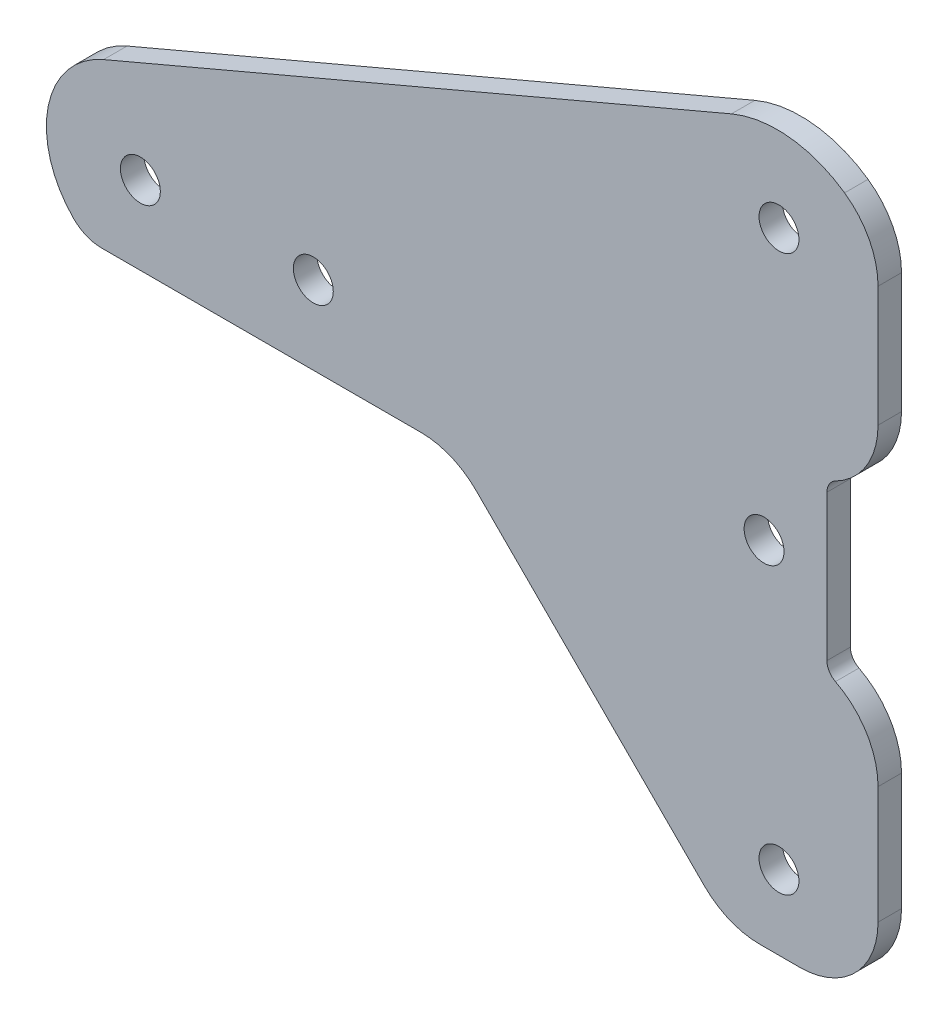
ISO-10303-21;
HEADER;
FILE_DESCRIPTION(('STEP AP214'),'2;1');
FILE_NAME('part.step','',(''),(''),'','','');
FILE_SCHEMA(('AUTOMOTIVE_DESIGN { 1 0 10303 214 1 1 1 1 }'));
ENDSEC;
DATA;
#1=APPLICATION_CONTEXT('core data for automotive mechanical design processes');
#2=APPLICATION_PROTOCOL_DEFINITION('international standard','automotive_design',2000,#1);
#3=PRODUCT_CONTEXT('',#1,'mechanical');
#4=PRODUCT('Part','Part','',(#3));
#5=PRODUCT_RELATED_PRODUCT_CATEGORY('part','',(#4));
#6=PRODUCT_DEFINITION_FORMATION('','',#4);
#7=PRODUCT_DEFINITION_CONTEXT('part definition',#1,'design');
#8=PRODUCT_DEFINITION('design','',#6,#7);
#9=PRODUCT_DEFINITION_SHAPE('','',#8);
#10=(LENGTH_UNIT() NAMED_UNIT(*) SI_UNIT(.MILLI.,.METRE.));
#11=(NAMED_UNIT(*) PLANE_ANGLE_UNIT() SI_UNIT($,.RADIAN.));
#12=(NAMED_UNIT(*) SI_UNIT($,.STERADIAN.) SOLID_ANGLE_UNIT());
#13=UNCERTAINTY_MEASURE_WITH_UNIT(LENGTH_MEASURE(1.E-05),#10,'distance_accuracy_value','');
#14=(GEOMETRIC_REPRESENTATION_CONTEXT(3) GLOBAL_UNCERTAINTY_ASSIGNED_CONTEXT((#13)) GLOBAL_UNIT_ASSIGNED_CONTEXT((#10,
#11,#12)) REPRESENTATION_CONTEXT('',''));
#15=CARTESIAN_POINT('',(0.,0.,0.));
#16=DIRECTION('',(0.,0.,1.));
#17=DIRECTION('',(1.,0.,0.));
#18=AXIS2_PLACEMENT_3D('',#15,#16,#17);
#19=CARTESIAN_POINT('',(-10.,20.0007818065908,3.));
#20=DIRECTION('',(0.,0.,-1.));
#21=DIRECTION('',(-1.,0.,0.));
#22=AXIS2_PLACEMENT_3D('',#19,#20,#21);
#23=PLANE('',#22);
#24=CARTESIAN_POINT('',(-10.,20.0007818065908,3.));
#25=DIRECTION('',(0.,0.,1.));
#26=DIRECTION('',(-1.,0.,0.));
#27=AXIS2_PLACEMENT_3D('',#24,#25,#26);
#28=CIRCLE('',#27,10.);
#29=CARTESIAN_POINT('',(-5.44166666666667,11.1001303010985,3.));
#30=VERTEX_POINT('',#29);
#31=CARTESIAN_POINT('',(0.,20.0007818065908,3.));
#32=VERTEX_POINT('',#31);
#33=EDGE_CURVE('E231',#30,#32,#28,.T.);
#34=ORIENTED_EDGE('',*,*,#33,.T.);
#35=DIRECTION('',(0.,1.,0.));
#36=VECTOR('',#35,1.);
#37=CARTESIAN_POINT('',(0.,20.0007818065908,3.));
#38=LINE('',#37,#36);
#39=CARTESIAN_POINT('',(0.,35.3807818065908,3.));
#40=VERTEX_POINT('',#39);
#41=EDGE_CURVE('E129',#32,#40,#38,.T.);
#42=ORIENTED_EDGE('',*,*,#41,.T.);
#43=CARTESIAN_POINT('',(-10.,35.3807818065908,3.));
#44=DIRECTION('',(0.,0.,1.));
#45=DIRECTION('',(-1.,0.,0.));
#46=AXIS2_PLACEMENT_3D('',#43,#44,#45);
#47=CIRCLE('',#46,10.);
#48=CARTESIAN_POINT('',(-4.27000000000017,43.5763354791624,3.));
#49=VERTEX_POINT('',#48);
#50=EDGE_CURVE('E276',#40,#49,#47,.T.);
#51=ORIENTED_EDGE('',*,*,#50,.T.);
#52=CARTESIAN_POINT('',(-12.8649999999999,31.2830049703049,3.));
#53=DIRECTION('',(0.,0.,1.));
#54=DIRECTION('',(-1.,0.,0.));
#55=AXIS2_PLACEMENT_3D('',#52,#53,#54);
#56=CIRCLE('',#55,15.);
#57=CARTESIAN_POINT('',(-18.7331957518129,45.0875070844126,3.));
#58=VERTEX_POINT('',#57);
#59=EDGE_CURVE('E295',#49,#58,#56,.T.);
#60=ORIENTED_EDGE('',*,*,#59,.T.);
#61=DIRECTION('',(-0.920300140940513,-0.391213050120868,0.));
#62=VECTOR('',#61,1.);
#63=CARTESIAN_POINT('',(-18.7331957518129,45.0875070844126,3.));
#64=LINE('',#63,#62);
#65=CARTESIAN_POINT('',(-98.9649620390068,10.9815533748754,3.));
#66=VERTEX_POINT('',#65);
#67=EDGE_CURVE('E292',#58,#66,#64,.T.);
#68=ORIENTED_EDGE('',*,*,#67,.T.);
#69=CARTESIAN_POINT('',(-94.2657220352064,-0.073065678539941,3.));
#70=DIRECTION('',(0.,0.,1.));
#71=DIRECTION('',(1.,0.,0.));
#72=AXIS2_PLACEMENT_3D('',#69,#70,#71);
#73=CIRCLE('',#72,12.0119714880386);
#74=CARTESIAN_POINT('',(-102.807556786901,-8.51845010461468,3.));
#75=VERTEX_POINT('',#74);
#76=EDGE_CURVE('E294',#66,#75,#73,.T.);
#77=ORIENTED_EDGE('',*,*,#76,.T.);
#78=CARTESIAN_POINT('',(-99.2520060764285,-5.003046977624,3.));
#79=DIRECTION('',(0.,0.,1.));
#80=DIRECTION('',(1.,0.,0.));
#81=AXIS2_PLACEMENT_3D('',#78,#79,#80);
#82=CIRCLE('',#81,5.00000000000001);
#83=CARTESIAN_POINT('',(-99.2520060764286,-10.003046977624,3.));
#84=VERTEX_POINT('',#83);
#85=EDGE_CURVE('E297',#75,#84,#82,.T.);
#86=ORIENTED_EDGE('',*,*,#85,.T.);
#87=DIRECTION('',(1.,0.,0.));
#88=VECTOR('',#87,1.);
#89=CARTESIAN_POINT('',(-99.2520060764286,-10.003046977624,3.));
#90=LINE('',#89,#88);
#91=CARTESIAN_POINT('',(-58.4120060764286,-10.003046977624,3.));
#92=VERTEX_POINT('',#91);
#93=EDGE_CURVE('E303',#84,#92,#90,.T.);
#94=ORIENTED_EDGE('',*,*,#93,.T.);
#95=CARTESIAN_POINT('',(-58.4120060764286,-20.003046977624,3.));
#96=DIRECTION('',(0.,0.,-1.));
#97=DIRECTION('',(-1.,0.,0.));
#98=AXIS2_PLACEMENT_3D('',#95,#96,#97);
#99=CIRCLE('',#98,10.);
#100=CARTESIAN_POINT('',(-51.3409382645631,-12.9319791657585,3.));
#101=VERTEX_POINT('',#100);
#102=EDGE_CURVE('E305',#92,#101,#99,.T.);
#103=ORIENTED_EDGE('',*,*,#102,.T.);
#104=DIRECTION('',(0.707106781186547,-0.707106781186548,0.));
#105=VECTOR('',#104,1.);
#106=CARTESIAN_POINT('',(-51.3409382645631,-12.9319791657585,3.));
#107=LINE('',#106,#105);
#108=CARTESIAN_POINT('',(-22.2010678118655,-42.0718496184562,3.));
#109=VERTEX_POINT('',#108);
#110=EDGE_CURVE('E307',#101,#109,#107,.T.);
#111=ORIENTED_EDGE('',*,*,#110,.T.);
#112=CARTESIAN_POINT('',(-15.13,-35.0007818065908,3.));
#113=DIRECTION('',(0.,0.,1.));
#114=DIRECTION('',(-1.,0.,0.));
#115=AXIS2_PLACEMENT_3D('',#112,#113,#114);
#116=CIRCLE('',#115,9.99999999999999);
#117=CARTESIAN_POINT('',(-15.13,-45.0007818065907,3.));
#118=VERTEX_POINT('',#117);
#119=EDGE_CURVE('E309',#109,#118,#116,.T.);
#120=ORIENTED_EDGE('',*,*,#119,.T.);
#121=DIRECTION('',(1.,0.,0.));
#122=VECTOR('',#121,1.);
#123=CARTESIAN_POINT('',(-15.13,-45.0007818065908,3.));
#124=LINE('',#123,#122);
#125=CARTESIAN_POINT('',(-10.,-45.0007818065908,3.));
#126=VERTEX_POINT('',#125);
#127=EDGE_CURVE('E311',#118,#126,#124,.T.);
#128=ORIENTED_EDGE('',*,*,#127,.T.);
#129=CARTESIAN_POINT('',(-10.,-35.0007818065907,3.));
#130=DIRECTION('',(0.,0.,1.));
#131=DIRECTION('',(-1.,0.,0.));
#132=AXIS2_PLACEMENT_3D('',#129,#130,#131);
#133=CIRCLE('',#132,10.);
#134=CARTESIAN_POINT('',(0.,-35.0007818065907,3.));
#135=VERTEX_POINT('',#134);
#136=EDGE_CURVE('E313',#126,#135,#133,.T.);
#137=ORIENTED_EDGE('',*,*,#136,.T.);
#138=DIRECTION('',(0.,1.,0.));
#139=VECTOR('',#138,1.);
#140=CARTESIAN_POINT('',(0.,-20.0007818065907,3.));
#141=LINE('',#140,#139);
#142=CARTESIAN_POINT('',(0.,-20.0007818065907,3.));
#143=VERTEX_POINT('',#142);
#144=EDGE_CURVE('E315',#135,#143,#141,.T.);
#145=ORIENTED_EDGE('',*,*,#144,.T.);
#146=CARTESIAN_POINT('',(-10.,-20.0007818065907,3.));
#147=DIRECTION('',(0.,0.,1.));
#148=DIRECTION('',(1.,0.,0.));
#149=AXIS2_PLACEMENT_3D('',#146,#147,#148);
#150=CIRCLE('',#149,10.);
#151=CARTESIAN_POINT('',(-5.44166666666666,-11.1001303010985,3.));
#152=VERTEX_POINT('',#151);
#153=EDGE_CURVE('E178',#143,#152,#150,.T.);
#154=ORIENTED_EDGE('',*,*,#153,.T.);
#155=CARTESIAN_POINT('',(-4.53,-9.32,3.));
#156=DIRECTION('',(0.,0.,-1.));
#157=DIRECTION('',(-1.,0.,0.));
#158=AXIS2_PLACEMENT_3D('',#155,#156,#157);
#159=CIRCLE('',#158,2.);
#160=CARTESIAN_POINT('',(-6.53,-9.32,3.));
#161=VERTEX_POINT('',#160);
#162=EDGE_CURVE('E172',#152,#161,#159,.T.);
#163=ORIENTED_EDGE('',*,*,#162,.T.);
#164=DIRECTION('',(0.,1.,0.));
#165=VECTOR('',#164,1.);
#166=CARTESIAN_POINT('',(-6.53,9.32,3.));
#167=LINE('',#166,#165);
#168=CARTESIAN_POINT('',(-6.53,9.32,3.));
#169=VERTEX_POINT('',#168);
#170=EDGE_CURVE('E176',#161,#169,#167,.T.);
#171=ORIENTED_EDGE('',*,*,#170,.T.);
#172=CARTESIAN_POINT('',(-4.53,9.32,3.));
#173=DIRECTION('',(0.,0.,-1.));
#174=DIRECTION('',(1.,0.,0.));
#175=AXIS2_PLACEMENT_3D('',#172,#173,#174);
#176=CIRCLE('',#175,2.);
#177=EDGE_CURVE('E56',#169,#30,#176,.T.);
#178=ORIENTED_EDGE('',*,*,#177,.T.);
#179=EDGE_LOOP('',(#34,#42,#51,#60,#68,#77,#86,#94,#103,#111,#120,#128,#137,#145,#154,#163,#171,#178));
#180=FACE_BOUND('',#179,.T.);
#181=CARTESIAN_POINT('',(-94.2643281289175,-0.00304697762400653,3.));
#182=DIRECTION('',(0.,0.,1.));
#183=DIRECTION('',(1.,0.,0.));
#184=AXIS2_PLACEMENT_3D('',#181,#182,#183);
#185=CIRCLE('',#184,2.54999999999999);
#186=CARTESIAN_POINT('',(-91.7143281289175,-0.00304697762400653,3.));
#187=VERTEX_POINT('',#186);
#188=EDGE_CURVE('E200',#187,#187,#185,.T.);
#189=ORIENTED_EDGE('',*,*,#188,.F.);
#190=EDGE_LOOP('',(#189));
#191=FACE_BOUND('',#190,.T.);
#192=CARTESIAN_POINT('',(-72.1643281289175,-0.00304697762400566,3.));
#193=DIRECTION('',(0.,0.,1.));
#194=DIRECTION('',(1.,0.,0.));
#195=AXIS2_PLACEMENT_3D('',#192,#193,#194);
#196=CIRCLE('',#195,2.54999999999999);
#197=CARTESIAN_POINT('',(-69.6143281289175,-0.00304697762400566,3.));
#198=VERTEX_POINT('',#197);
#199=EDGE_CURVE('E389',#198,#198,#196,.T.);
#200=ORIENTED_EDGE('',*,*,#199,.F.);
#201=EDGE_LOOP('',(#200));
#202=FACE_BOUND('',#201,.T.);
#203=CARTESIAN_POINT('',(-14.5643281289175,-0.00304697762400566,3.));
#204=DIRECTION('',(0.,0.,1.));
#205=DIRECTION('',(1.,0.,0.));
#206=AXIS2_PLACEMENT_3D('',#203,#204,#205);
#207=CIRCLE('',#206,2.55);
#208=CARTESIAN_POINT('',(-12.0143281289175,-0.00304697762400566,3.));
#209=VERTEX_POINT('',#208);
#210=EDGE_CURVE('E383',#209,#209,#207,.T.);
#211=ORIENTED_EDGE('',*,*,#210,.F.);
#212=EDGE_LOOP('',(#211));
#213=FACE_BOUND('',#212,.T.);
#214=CARTESIAN_POINT('',(-12.66,35.4992181934092,3.));
#215=DIRECTION('',(0.,0.,1.));
#216=DIRECTION('',(1.,0.,0.));
#217=AXIS2_PLACEMENT_3D('',#214,#215,#216);
#218=CIRCLE('',#217,2.55);
#219=CARTESIAN_POINT('',(-10.11,35.4992181934092,3.));
#220=VERTEX_POINT('',#219);
#221=EDGE_CURVE('E377',#220,#220,#218,.T.);
#222=ORIENTED_EDGE('',*,*,#221,.F.);
#223=EDGE_LOOP('',(#222));
#224=FACE_BOUND('',#223,.T.);
#225=CARTESIAN_POINT('',(-12.66,-35.5007818065907,3.));
#226=DIRECTION('',(0.,0.,1.));
#227=DIRECTION('',(1.,0.,0.));
#228=AXIS2_PLACEMENT_3D('',#225,#226,#227);
#229=CIRCLE('',#228,2.55);
#230=CARTESIAN_POINT('',(-10.11,-35.5007818065907,3.));
#231=VERTEX_POINT('',#230);
#232=EDGE_CURVE('E368',#231,#231,#229,.T.);
#233=ORIENTED_EDGE('',*,*,#232,.F.);
#234=EDGE_LOOP('',(#233));
#235=FACE_BOUND('',#234,.T.);
#236=ADVANCED_FACE('F39',(#180,#191,#202,#213,#224,#235),#23,.F.);
#237=CARTESIAN_POINT('',(-10.,20.0007818065908,0.));
#238=DIRECTION('',(0.,0.,-1.));
#239=DIRECTION('',(-1.,0.,0.));
#240=AXIS2_PLACEMENT_3D('',#237,#238,#239);
#241=PLANE('',#240);
#242=CARTESIAN_POINT('',(-12.66,35.4992181934092,0.));
#243=DIRECTION('',(0.,0.,1.));
#244=DIRECTION('',(1.,0.,0.));
#245=AXIS2_PLACEMENT_3D('',#242,#243,#244);
#246=CIRCLE('',#245,2.55);
#247=CARTESIAN_POINT('',(-10.11,35.4992181934092,0.));
#248=VERTEX_POINT('',#247);
#249=EDGE_CURVE('E374',#248,#248,#246,.T.);
#250=ORIENTED_EDGE('',*,*,#249,.T.);
#251=EDGE_LOOP('',(#250));
#252=FACE_BOUND('',#251,.T.);
#253=CARTESIAN_POINT('',(-72.1643281289175,-0.00304697762400566,0.));
#254=DIRECTION('',(0.,0.,1.));
#255=DIRECTION('',(1.,0.,0.));
#256=AXIS2_PLACEMENT_3D('',#253,#254,#255);
#257=CIRCLE('',#256,2.54999999999999);
#258=CARTESIAN_POINT('',(-69.6143281289175,-0.00304697762400566,0.));
#259=VERTEX_POINT('',#258);
#260=EDGE_CURVE('E386',#259,#259,#257,.T.);
#261=ORIENTED_EDGE('',*,*,#260,.T.);
#262=EDGE_LOOP('',(#261));
#263=FACE_BOUND('',#262,.T.);
#264=CARTESIAN_POINT('',(-10.,20.0007818065908,0.));
#265=DIRECTION('',(0.,0.,1.));
#266=DIRECTION('',(-1.,0.,0.));
#267=AXIS2_PLACEMENT_3D('',#264,#265,#266);
#268=CIRCLE('',#267,10.);
#269=CARTESIAN_POINT('',(-5.44166666666667,11.1001303010985,0.));
#270=VERTEX_POINT('',#269);
#271=CARTESIAN_POINT('',(0.,20.0007818065908,0.));
#272=VERTEX_POINT('',#271);
#273=EDGE_CURVE('E196',#270,#272,#268,.T.);
#274=ORIENTED_EDGE('',*,*,#273,.F.);
#275=CARTESIAN_POINT('',(-4.53,9.32,0.));
#276=DIRECTION('',(0.,0.,-1.));
#277=DIRECTION('',(1.,0.,0.));
#278=AXIS2_PLACEMENT_3D('',#275,#276,#277);
#279=CIRCLE('',#278,2.);
#280=CARTESIAN_POINT('',(-6.53,9.32,0.));
#281=VERTEX_POINT('',#280);
#282=EDGE_CURVE('E121',#281,#270,#279,.T.);
#283=ORIENTED_EDGE('',*,*,#282,.F.);
#284=DIRECTION('',(0.,1.,0.));
#285=VECTOR('',#284,1.);
#286=CARTESIAN_POINT('',(-6.53,9.32,0.));
#287=LINE('',#286,#285);
#288=CARTESIAN_POINT('',(-6.53,-9.32,0.));
#289=VERTEX_POINT('',#288);
#290=EDGE_CURVE('E115',#289,#281,#287,.T.);
#291=ORIENTED_EDGE('',*,*,#290,.F.);
#292=CARTESIAN_POINT('',(-4.53,-9.32,0.));
#293=DIRECTION('',(0.,0.,-1.));
#294=DIRECTION('',(-1.,0.,0.));
#295=AXIS2_PLACEMENT_3D('',#292,#293,#294);
#296=CIRCLE('',#295,2.);
#297=CARTESIAN_POINT('',(-5.44166666666666,-11.1001303010985,0.));
#298=VERTEX_POINT('',#297);
#299=EDGE_CURVE('E186',#298,#289,#296,.T.);
#300=ORIENTED_EDGE('',*,*,#299,.F.);
#301=CARTESIAN_POINT('',(-10.,-20.0007818065907,0.));
#302=DIRECTION('',(0.,0.,1.));
#303=DIRECTION('',(1.,0.,0.));
#304=AXIS2_PLACEMENT_3D('',#301,#302,#303);
#305=CIRCLE('',#304,10.);
#306=CARTESIAN_POINT('',(0.,-20.0007818065907,0.));
#307=VERTEX_POINT('',#306);
#308=EDGE_CURVE('E226',#307,#298,#305,.T.);
#309=ORIENTED_EDGE('',*,*,#308,.F.);
#310=DIRECTION('',(0.,1.,0.));
#311=VECTOR('',#310,1.);
#312=CARTESIAN_POINT('',(0.,-20.0007818065907,0.));
#313=LINE('',#312,#311);
#314=CARTESIAN_POINT('',(0.,-35.0007818065907,0.));
#315=VERTEX_POINT('',#314);
#316=EDGE_CURVE('E224',#315,#307,#313,.T.);
#317=ORIENTED_EDGE('',*,*,#316,.F.);
#318=CARTESIAN_POINT('',(-10.,-35.0007818065907,0.));
#319=DIRECTION('',(0.,0.,1.));
#320=DIRECTION('',(-1.,0.,0.));
#321=AXIS2_PLACEMENT_3D('',#318,#319,#320);
#322=CIRCLE('',#321,10.);
#323=CARTESIAN_POINT('',(-10.,-45.0007818065908,0.));
#324=VERTEX_POINT('',#323);
#325=EDGE_CURVE('E222',#324,#315,#322,.T.);
#326=ORIENTED_EDGE('',*,*,#325,.F.);
#327=DIRECTION('',(1.,0.,0.));
#328=VECTOR('',#327,1.);
#329=CARTESIAN_POINT('',(-15.13,-45.0007818065908,0.));
#330=LINE('',#329,#328);
#331=CARTESIAN_POINT('',(-15.13,-45.0007818065907,0.));
#332=VERTEX_POINT('',#331);
#333=EDGE_CURVE('E220',#332,#324,#330,.T.);
#334=ORIENTED_EDGE('',*,*,#333,.F.);
#335=CARTESIAN_POINT('',(-15.13,-35.0007818065908,0.));
#336=DIRECTION('',(0.,0.,1.));
#337=DIRECTION('',(-1.,0.,0.));
#338=AXIS2_PLACEMENT_3D('',#335,#336,#337);
#339=CIRCLE('',#338,9.99999999999999);
#340=CARTESIAN_POINT('',(-22.2010678118655,-42.0718496184562,0.));
#341=VERTEX_POINT('',#340);
#342=EDGE_CURVE('E218',#341,#332,#339,.T.);
#343=ORIENTED_EDGE('',*,*,#342,.F.);
#344=DIRECTION('',(0.707106781186547,-0.707106781186548,0.));
#345=VECTOR('',#344,1.);
#346=CARTESIAN_POINT('',(-51.3409382645631,-12.9319791657585,0.));
#347=LINE('',#346,#345);
#348=CARTESIAN_POINT('',(-51.3409382645631,-12.9319791657585,0.));
#349=VERTEX_POINT('',#348);
#350=EDGE_CURVE('E216',#349,#341,#347,.T.);
#351=ORIENTED_EDGE('',*,*,#350,.F.);
#352=CARTESIAN_POINT('',(-58.4120060764286,-20.003046977624,0.));
#353=DIRECTION('',(0.,0.,-1.));
#354=DIRECTION('',(-1.,0.,0.));
#355=AXIS2_PLACEMENT_3D('',#352,#353,#354);
#356=CIRCLE('',#355,10.);
#357=CARTESIAN_POINT('',(-58.4120060764286,-10.003046977624,0.));
#358=VERTEX_POINT('',#357);
#359=EDGE_CURVE('E214',#358,#349,#356,.T.);
#360=ORIENTED_EDGE('',*,*,#359,.F.);
#361=DIRECTION('',(1.,0.,0.));
#362=VECTOR('',#361,1.);
#363=CARTESIAN_POINT('',(-99.2520060764286,-10.003046977624,0.));
#364=LINE('',#363,#362);
#365=CARTESIAN_POINT('',(-99.2520060764286,-10.003046977624,0.));
#366=VERTEX_POINT('',#365);
#367=EDGE_CURVE('E212',#366,#358,#364,.T.);
#368=ORIENTED_EDGE('',*,*,#367,.F.);
#369=CARTESIAN_POINT('',(-99.2520060764285,-5.003046977624,0.));
#370=DIRECTION('',(0.,0.,1.));
#371=DIRECTION('',(1.,0.,0.));
#372=AXIS2_PLACEMENT_3D('',#369,#370,#371);
#373=CIRCLE('',#372,5.00000000000001);
#374=CARTESIAN_POINT('',(-102.807556786901,-8.51845010461468,0.));
#375=VERTEX_POINT('',#374);
#376=EDGE_CURVE('E210',#375,#366,#373,.T.);
#377=ORIENTED_EDGE('',*,*,#376,.F.);
#378=CARTESIAN_POINT('',(-94.2657220352064,-0.073065678539941,0.));
#379=DIRECTION('',(0.,0.,1.));
#380=DIRECTION('',(1.,0.,0.));
#381=AXIS2_PLACEMENT_3D('',#378,#379,#380);
#382=CIRCLE('',#381,12.0119714880386);
#383=CARTESIAN_POINT('',(-98.9649620390068,10.9815533748754,0.));
#384=VERTEX_POINT('',#383);
#385=EDGE_CURVE('E208',#384,#375,#382,.T.);
#386=ORIENTED_EDGE('',*,*,#385,.F.);
#387=DIRECTION('',(-0.920300140940513,-0.391213050120868,0.));
#388=VECTOR('',#387,1.);
#389=CARTESIAN_POINT('',(-18.7331957518129,45.0875070844126,0.));
#390=LINE('',#389,#388);
#391=CARTESIAN_POINT('',(-18.7331957518129,45.0875070844126,0.));
#392=VERTEX_POINT('',#391);
#393=EDGE_CURVE('E206',#392,#384,#390,.T.);
#394=ORIENTED_EDGE('',*,*,#393,.F.);
#395=CARTESIAN_POINT('',(-12.8649999999999,31.2830049703049,0.));
#396=DIRECTION('',(0.,0.,1.));
#397=DIRECTION('',(-1.,0.,0.));
#398=AXIS2_PLACEMENT_3D('',#395,#396,#397);
#399=CIRCLE('',#398,15.);
#400=CARTESIAN_POINT('',(-4.27000000000017,43.5763354791624,0.));
#401=VERTEX_POINT('',#400);
#402=EDGE_CURVE('E204',#401,#392,#399,.T.);
#403=ORIENTED_EDGE('',*,*,#402,.F.);
#404=CARTESIAN_POINT('',(-10.,35.3807818065908,0.));
#405=DIRECTION('',(0.,0.,1.));
#406=DIRECTION('',(-1.,0.,0.));
#407=AXIS2_PLACEMENT_3D('',#404,#405,#406);
#408=CIRCLE('',#407,10.);
#409=CARTESIAN_POINT('',(0.,35.3807818065908,0.));
#410=VERTEX_POINT('',#409);
#411=EDGE_CURVE('E202',#410,#401,#408,.T.);
#412=ORIENTED_EDGE('',*,*,#411,.F.);
#413=DIRECTION('',(0.,1.,0.));
#414=VECTOR('',#413,1.);
#415=CARTESIAN_POINT('',(0.,20.0007818065908,0.));
#416=LINE('',#415,#414);
#417=EDGE_CURVE('E199',#272,#410,#416,.T.);
#418=ORIENTED_EDGE('',*,*,#417,.F.);
#419=EDGE_LOOP('',(#274,#283,#291,#300,#309,#317,#326,#334,#343,#351,#360,#368,#377,#386,#394,
#403,#412,#418));
#420=FACE_BOUND('',#419,.T.);
#421=CARTESIAN_POINT('',(-94.2643281289175,-0.00304697762400653,0.));
#422=DIRECTION('',(0.,0.,1.));
#423=DIRECTION('',(1.,0.,0.));
#424=AXIS2_PLACEMENT_3D('',#421,#422,#423);
#425=CIRCLE('',#424,2.54999999999999);
#426=CARTESIAN_POINT('',(-91.7143281289175,-0.00304697762400653,0.));
#427=VERTEX_POINT('',#426);
#428=EDGE_CURVE('E392',#427,#427,#425,.T.);
#429=ORIENTED_EDGE('',*,*,#428,.T.);
#430=EDGE_LOOP('',(#429));
#431=FACE_BOUND('',#430,.T.);
#432=CARTESIAN_POINT('',(-14.5643281289175,-0.00304697762400566,0.));
#433=DIRECTION('',(0.,0.,1.));
#434=DIRECTION('',(1.,0.,0.));
#435=AXIS2_PLACEMENT_3D('',#432,#433,#434);
#436=CIRCLE('',#435,2.55);
#437=CARTESIAN_POINT('',(-12.0143281289175,-0.00304697762400566,0.));
#438=VERTEX_POINT('',#437);
#439=EDGE_CURVE('E380',#438,#438,#436,.T.);
#440=ORIENTED_EDGE('',*,*,#439,.T.);
#441=EDGE_LOOP('',(#440));
#442=FACE_BOUND('',#441,.T.);
#443=CARTESIAN_POINT('',(-12.66,-35.5007818065907,0.));
#444=DIRECTION('',(0.,0.,1.));
#445=DIRECTION('',(1.,0.,0.));
#446=AXIS2_PLACEMENT_3D('',#443,#444,#445);
#447=CIRCLE('',#446,2.55);
#448=CARTESIAN_POINT('',(-10.11,-35.5007818065907,0.));
#449=VERTEX_POINT('',#448);
#450=EDGE_CURVE('E371',#449,#449,#447,.T.);
#451=ORIENTED_EDGE('',*,*,#450,.T.);
#452=EDGE_LOOP('',(#451));
#453=FACE_BOUND('',#452,.T.);
#454=ADVANCED_FACE('F280',(#252,#263,#420,#431,#442,#453),#241,.T.);
#455=CARTESIAN_POINT('',(-10.,20.0007818065908,3.));
#456=DIRECTION('',(0.,0.,-1.));
#457=DIRECTION('',(-1.,0.,0.));
#458=AXIS2_PLACEMENT_3D('',#455,#456,#457);
#459=CYLINDRICAL_SURFACE('',#458,10.);
#460=ORIENTED_EDGE('',*,*,#273,.T.);
#461=DIRECTION('',(0.,0.,-1.));
#462=VECTOR('',#461,1.);
#463=CARTESIAN_POINT('',(0.,20.0007818065908,3.));
#464=LINE('',#463,#462);
#465=EDGE_CURVE('E11',#32,#272,#464,.T.);
#466=ORIENTED_EDGE('',*,*,#465,.F.);
#467=ORIENTED_EDGE('',*,*,#33,.F.);
#468=DIRECTION('',(0.,0.,-1.));
#469=VECTOR('',#468,1.);
#470=CARTESIAN_POINT('',(-5.44166666666667,11.1001303010985,3.));
#471=LINE('',#470,#469);
#472=EDGE_CURVE('E192',#30,#270,#471,.T.);
#473=ORIENTED_EDGE('',*,*,#472,.T.);
#474=EDGE_LOOP('',(#460,#466,#467,#473));
#475=FACE_BOUND('',#474,.T.);
#476=ADVANCED_FACE('F41',(#475),#459,.T.);
#477=CARTESIAN_POINT('',(0.,20.0007818065908,3.));
#478=DIRECTION('',(-1.,0.,0.));
#479=DIRECTION('',(0.,0.,1.));
#480=AXIS2_PLACEMENT_3D('',#477,#478,#479);
#481=PLANE('',#480);
#482=ORIENTED_EDGE('',*,*,#417,.T.);
#483=DIRECTION('',(0.,0.,-1.));
#484=VECTOR('',#483,1.);
#485=CARTESIAN_POINT('',(0.,35.3807818065908,3.));
#486=LINE('',#485,#484);
#487=EDGE_CURVE('E48',#40,#410,#486,.T.);
#488=ORIENTED_EDGE('',*,*,#487,.F.);
#489=ORIENTED_EDGE('',*,*,#41,.F.);
#490=ORIENTED_EDGE('',*,*,#465,.T.);
#491=EDGE_LOOP('',(#482,#488,#489,#490));
#492=FACE_BOUND('',#491,.T.);
#493=ADVANCED_FACE('F578',(#492),#481,.F.);
#494=CARTESIAN_POINT('',(-10.,35.3807818065908,3.));
#495=DIRECTION('',(0.,0.,-1.));
#496=DIRECTION('',(-1.,0.,0.));
#497=AXIS2_PLACEMENT_3D('',#494,#495,#496);
#498=CYLINDRICAL_SURFACE('',#497,10.);
#499=ORIENTED_EDGE('',*,*,#411,.T.);
#500=DIRECTION('',(0.,0.,-1.));
#501=VECTOR('',#500,1.);
#502=CARTESIAN_POINT('',(-4.27000000000017,43.5763354791624,3.));
#503=LINE('',#502,#501);
#504=EDGE_CURVE('E268',#49,#401,#503,.T.);
#505=ORIENTED_EDGE('',*,*,#504,.F.);
#506=ORIENTED_EDGE('',*,*,#50,.F.);
#507=ORIENTED_EDGE('',*,*,#487,.T.);
#508=EDGE_LOOP('',(#499,#505,#506,#507));
#509=FACE_BOUND('',#508,.T.);
#510=ADVANCED_FACE('F274',(#509),#498,.T.);
#511=CARTESIAN_POINT('',(-12.8649999999999,31.2830049703049,3.));
#512=DIRECTION('',(0.,0.,-1.));
#513=DIRECTION('',(-1.,0.,0.));
#514=AXIS2_PLACEMENT_3D('',#511,#512,#513);
#515=CYLINDRICAL_SURFACE('',#514,15.);
#516=ORIENTED_EDGE('',*,*,#402,.T.);
#517=DIRECTION('',(0.,0.,-1.));
#518=VECTOR('',#517,1.);
#519=CARTESIAN_POINT('',(-18.7331957518129,45.0875070844126,3.));
#520=LINE('',#519,#518);
#521=EDGE_CURVE('E265',#58,#392,#520,.T.);
#522=ORIENTED_EDGE('',*,*,#521,.F.);
#523=ORIENTED_EDGE('',*,*,#59,.F.);
#524=ORIENTED_EDGE('',*,*,#504,.T.);
#525=EDGE_LOOP('',(#516,#522,#523,#524));
#526=FACE_BOUND('',#525,.T.);
#527=ADVANCED_FACE('F286',(#526),#515,.T.);
#528=CARTESIAN_POINT('',(-18.7331957518129,45.0875070844126,3.));
#529=DIRECTION('',(0.391213050120868,-0.920300140940513,0.));
#530=DIRECTION('',(0.920300140940513,0.391213050120868,0.));
#531=AXIS2_PLACEMENT_3D('',#528,#529,#530);
#532=PLANE('',#531);
#533=ORIENTED_EDGE('',*,*,#393,.T.);
#534=DIRECTION('',(0.,0.,-1.));
#535=VECTOR('',#534,1.);
#536=CARTESIAN_POINT('',(-98.9649620390068,10.9815533748754,3.));
#537=LINE('',#536,#535);
#538=EDGE_CURVE('E262',#66,#384,#537,.T.);
#539=ORIENTED_EDGE('',*,*,#538,.F.);
#540=ORIENTED_EDGE('',*,*,#67,.F.);
#541=ORIENTED_EDGE('',*,*,#521,.T.);
#542=EDGE_LOOP('',(#533,#539,#540,#541));
#543=FACE_BOUND('',#542,.T.);
#544=ADVANCED_FACE('F290',(#543),#532,.F.);
#545=CARTESIAN_POINT('',(-94.2657220352064,-0.073065678539941,3.));
#546=DIRECTION('',(0.,0.,-1.));
#547=DIRECTION('',(-1.,0.,0.));
#548=AXIS2_PLACEMENT_3D('',#545,#546,#547);
#549=CYLINDRICAL_SURFACE('',#548,12.0119714880386);
#550=ORIENTED_EDGE('',*,*,#385,.T.);
#551=DIRECTION('',(0.,0.,-1.));
#552=VECTOR('',#551,1.);
#553=CARTESIAN_POINT('',(-102.807556786901,-8.51845010461468,3.));
#554=LINE('',#553,#552);
#555=EDGE_CURVE('E259',#75,#375,#554,.T.);
#556=ORIENTED_EDGE('',*,*,#555,.F.);
#557=ORIENTED_EDGE('',*,*,#76,.F.);
#558=ORIENTED_EDGE('',*,*,#538,.T.);
#559=EDGE_LOOP('',(#550,#556,#557,#558));
#560=FACE_BOUND('',#559,.T.);
#561=ADVANCED_FACE('F543',(#560),#549,.T.);
#562=CARTESIAN_POINT('',(-99.2520060764285,-5.003046977624,3.));
#563=DIRECTION('',(0.,0.,-1.));
#564=DIRECTION('',(-1.,0.,0.));
#565=AXIS2_PLACEMENT_3D('',#562,#563,#564);
#566=CYLINDRICAL_SURFACE('',#565,5.00000000000001);
#567=ORIENTED_EDGE('',*,*,#376,.T.);
#568=DIRECTION('',(0.,0.,-1.));
#569=VECTOR('',#568,1.);
#570=CARTESIAN_POINT('',(-99.2520060764286,-10.003046977624,3.));
#571=LINE('',#570,#569);
#572=EDGE_CURVE('E256',#84,#366,#571,.T.);
#573=ORIENTED_EDGE('',*,*,#572,.F.);
#574=ORIENTED_EDGE('',*,*,#85,.F.);
#575=ORIENTED_EDGE('',*,*,#555,.T.);
#576=EDGE_LOOP('',(#567,#573,#574,#575));
#577=FACE_BOUND('',#576,.T.);
#578=ADVANCED_FACE('F533',(#577),#566,.T.);
#579=CARTESIAN_POINT('',(-99.2520060764286,-10.003046977624,3.));
#580=DIRECTION('',(0.,1.,0.));
#581=DIRECTION('',(-1.,0.,0.));
#582=AXIS2_PLACEMENT_3D('',#579,#580,#581);
#583=PLANE('',#582);
#584=ORIENTED_EDGE('',*,*,#367,.T.);
#585=DIRECTION('',(0.,0.,-1.));
#586=VECTOR('',#585,1.);
#587=CARTESIAN_POINT('',(-58.4120060764286,-10.003046977624,3.));
#588=LINE('',#587,#586);
#589=EDGE_CURVE('E253',#92,#358,#588,.T.);
#590=ORIENTED_EDGE('',*,*,#589,.F.);
#591=ORIENTED_EDGE('',*,*,#93,.F.);
#592=ORIENTED_EDGE('',*,*,#572,.T.);
#593=EDGE_LOOP('',(#584,#590,#591,#592));
#594=FACE_BOUND('',#593,.T.);
#595=ADVANCED_FACE('F523',(#594),#583,.F.);
#596=CARTESIAN_POINT('',(-58.4120060764286,-20.003046977624,3.));
#597=DIRECTION('',(0.,0.,-1.));
#598=DIRECTION('',(-1.,0.,0.));
#599=AXIS2_PLACEMENT_3D('',#596,#597,#598);
#600=CYLINDRICAL_SURFACE('',#599,10.);
#601=ORIENTED_EDGE('',*,*,#359,.T.);
#602=DIRECTION('',(0.,0.,-1.));
#603=VECTOR('',#602,1.);
#604=CARTESIAN_POINT('',(-51.3409382645631,-12.9319791657585,3.));
#605=LINE('',#604,#603);
#606=EDGE_CURVE('E250',#101,#349,#605,.T.);
#607=ORIENTED_EDGE('',*,*,#606,.F.);
#608=ORIENTED_EDGE('',*,*,#102,.F.);
#609=ORIENTED_EDGE('',*,*,#589,.T.);
#610=EDGE_LOOP('',(#601,#607,#608,#609));
#611=FACE_BOUND('',#610,.T.);
#612=ADVANCED_FACE('F513',(#611),#600,.F.);
#613=CARTESIAN_POINT('',(-51.3409382645631,-12.9319791657585,3.));
#614=DIRECTION('',(0.707106781186548,0.707106781186547,0.));
#615=DIRECTION('',(-0.707106781186547,0.707106781186548,0.));
#616=AXIS2_PLACEMENT_3D('',#613,#614,#615);
#617=PLANE('',#616);
#618=ORIENTED_EDGE('',*,*,#350,.T.);
#619=DIRECTION('',(0.,0.,-1.));
#620=VECTOR('',#619,1.);
#621=CARTESIAN_POINT('',(-22.2010678118655,-42.0718496184562,3.));
#622=LINE('',#621,#620);
#623=EDGE_CURVE('E247',#109,#341,#622,.T.);
#624=ORIENTED_EDGE('',*,*,#623,.F.);
#625=ORIENTED_EDGE('',*,*,#110,.F.);
#626=ORIENTED_EDGE('',*,*,#606,.T.);
#627=EDGE_LOOP('',(#618,#624,#625,#626));
#628=FACE_BOUND('',#627,.T.);
#629=ADVANCED_FACE('F503',(#628),#617,.F.);
#630=CARTESIAN_POINT('',(-15.13,-35.0007818065908,3.));
#631=DIRECTION('',(0.,0.,-1.));
#632=DIRECTION('',(-1.,0.,0.));
#633=AXIS2_PLACEMENT_3D('',#630,#631,#632);
#634=CYLINDRICAL_SURFACE('',#633,9.99999999999999);
#635=ORIENTED_EDGE('',*,*,#342,.T.);
#636=DIRECTION('',(0.,0.,-1.));
#637=VECTOR('',#636,1.);
#638=CARTESIAN_POINT('',(-15.13,-45.0007818065907,3.));
#639=LINE('',#638,#637);
#640=EDGE_CURVE('E244',#118,#332,#639,.T.);
#641=ORIENTED_EDGE('',*,*,#640,.F.);
#642=ORIENTED_EDGE('',*,*,#119,.F.);
#643=ORIENTED_EDGE('',*,*,#623,.T.);
#644=EDGE_LOOP('',(#635,#641,#642,#643));
#645=FACE_BOUND('',#644,.T.);
#646=ADVANCED_FACE('F493',(#645),#634,.T.);
#647=CARTESIAN_POINT('',(-15.13,-45.0007818065908,3.));
#648=DIRECTION('',(0.,1.,0.));
#649=DIRECTION('',(0.,0.,1.));
#650=AXIS2_PLACEMENT_3D('',#647,#648,#649);
#651=PLANE('',#650);
#652=ORIENTED_EDGE('',*,*,#333,.T.);
#653=DIRECTION('',(0.,0.,-1.));
#654=VECTOR('',#653,1.);
#655=CARTESIAN_POINT('',(-10.,-45.0007818065908,3.));
#656=LINE('',#655,#654);
#657=EDGE_CURVE('E241',#126,#324,#656,.T.);
#658=ORIENTED_EDGE('',*,*,#657,.F.);
#659=ORIENTED_EDGE('',*,*,#127,.F.);
#660=ORIENTED_EDGE('',*,*,#640,.T.);
#661=EDGE_LOOP('',(#652,#658,#659,#660));
#662=FACE_BOUND('',#661,.T.);
#663=ADVANCED_FACE('F483',(#662),#651,.F.);
#664=CARTESIAN_POINT('',(-10.,-35.0007818065907,3.));
#665=DIRECTION('',(0.,0.,-1.));
#666=DIRECTION('',(-1.,0.,0.));
#667=AXIS2_PLACEMENT_3D('',#664,#665,#666);
#668=CYLINDRICAL_SURFACE('',#667,10.);
#669=ORIENTED_EDGE('',*,*,#325,.T.);
#670=DIRECTION('',(0.,0.,-1.));
#671=VECTOR('',#670,1.);
#672=CARTESIAN_POINT('',(0.,-35.0007818065907,3.));
#673=LINE('',#672,#671);
#674=EDGE_CURVE('E238',#135,#315,#673,.T.);
#675=ORIENTED_EDGE('',*,*,#674,.F.);
#676=ORIENTED_EDGE('',*,*,#136,.F.);
#677=ORIENTED_EDGE('',*,*,#657,.T.);
#678=EDGE_LOOP('',(#669,#675,#676,#677));
#679=FACE_BOUND('',#678,.T.);
#680=ADVANCED_FACE('F474',(#679),#668,.T.);
#681=CARTESIAN_POINT('',(0.,-20.0007818065907,3.));
#682=DIRECTION('',(-1.,0.,0.));
#683=DIRECTION('',(0.,-1.,0.));
#684=AXIS2_PLACEMENT_3D('',#681,#682,#683);
#685=PLANE('',#684);
#686=ORIENTED_EDGE('',*,*,#316,.T.);
#687=DIRECTION('',(0.,0.,-1.));
#688=VECTOR('',#687,1.);
#689=CARTESIAN_POINT('',(0.,-20.0007818065907,3.));
#690=LINE('',#689,#688);
#691=EDGE_CURVE('E235',#143,#307,#690,.T.);
#692=ORIENTED_EDGE('',*,*,#691,.F.);
#693=ORIENTED_EDGE('',*,*,#144,.F.);
#694=ORIENTED_EDGE('',*,*,#674,.T.);
#695=EDGE_LOOP('',(#686,#692,#693,#694));
#696=FACE_BOUND('',#695,.T.);
#697=ADVANCED_FACE('F321',(#696),#685,.F.);
#698=CARTESIAN_POINT('',(-10.,-20.0007818065907,3.));
#699=DIRECTION('',(0.,0.,-1.));
#700=DIRECTION('',(-1.,0.,0.));
#701=AXIS2_PLACEMENT_3D('',#698,#699,#700);
#702=CYLINDRICAL_SURFACE('',#701,10.);
#703=ORIENTED_EDGE('',*,*,#308,.T.);
#704=DIRECTION('',(0.,0.,-1.));
#705=VECTOR('',#704,1.);
#706=CARTESIAN_POINT('',(-5.44166666666666,-11.1001303010985,3.));
#707=LINE('',#706,#705);
#708=EDGE_CURVE('E187',#152,#298,#707,.T.);
#709=ORIENTED_EDGE('',*,*,#708,.F.);
#710=ORIENTED_EDGE('',*,*,#153,.F.);
#711=ORIENTED_EDGE('',*,*,#691,.T.);
#712=EDGE_LOOP('',(#703,#709,#710,#711));
#713=FACE_BOUND('',#712,.T.);
#714=ADVANCED_FACE('F325',(#713),#702,.T.);
#715=CARTESIAN_POINT('',(-4.53,-9.32,3.));
#716=DIRECTION('',(0.,0.,-1.));
#717=DIRECTION('',(-1.,0.,0.));
#718=AXIS2_PLACEMENT_3D('',#715,#716,#717);
#719=CYLINDRICAL_SURFACE('',#718,2.);
#720=ORIENTED_EDGE('',*,*,#299,.T.);
#721=DIRECTION('',(0.,0.,-1.));
#722=VECTOR('',#721,1.);
#723=CARTESIAN_POINT('',(-6.53,-9.32,3.));
#724=LINE('',#723,#722);
#725=EDGE_CURVE('E183',#161,#289,#724,.T.);
#726=ORIENTED_EDGE('',*,*,#725,.F.);
#727=ORIENTED_EDGE('',*,*,#162,.F.);
#728=ORIENTED_EDGE('',*,*,#708,.T.);
#729=EDGE_LOOP('',(#720,#726,#727,#728));
#730=FACE_BOUND('',#729,.T.);
#731=ADVANCED_FACE('F184',(#730),#719,.F.);
#732=CARTESIAN_POINT('',(-6.53,9.32,3.));
#733=DIRECTION('',(-1.,0.,0.));
#734=DIRECTION('',(0.,0.,1.));
#735=AXIS2_PLACEMENT_3D('',#732,#733,#734);
#736=PLANE('',#735);
#737=ORIENTED_EDGE('',*,*,#290,.T.);
#738=DIRECTION('',(0.,0.,-1.));
#739=VECTOR('',#738,1.);
#740=CARTESIAN_POINT('',(-6.53,9.32,3.));
#741=LINE('',#740,#739);
#742=EDGE_CURVE('E188',#169,#281,#741,.T.);
#743=ORIENTED_EDGE('',*,*,#742,.F.);
#744=ORIENTED_EDGE('',*,*,#170,.F.);
#745=ORIENTED_EDGE('',*,*,#725,.T.);
#746=EDGE_LOOP('',(#737,#743,#744,#745));
#747=FACE_BOUND('',#746,.T.);
#748=ADVANCED_FACE('F190',(#747),#736,.F.);
#749=CARTESIAN_POINT('',(-4.53,9.32,3.));
#750=DIRECTION('',(0.,0.,-1.));
#751=DIRECTION('',(-1.,0.,0.));
#752=AXIS2_PLACEMENT_3D('',#749,#750,#751);
#753=CYLINDRICAL_SURFACE('',#752,2.);
#754=ORIENTED_EDGE('',*,*,#282,.T.);
#755=ORIENTED_EDGE('',*,*,#472,.F.);
#756=ORIENTED_EDGE('',*,*,#177,.F.);
#757=ORIENTED_EDGE('',*,*,#742,.T.);
#758=EDGE_LOOP('',(#754,#755,#756,#757));
#759=FACE_BOUND('',#758,.T.);
#760=ADVANCED_FACE('F329',(#759),#753,.F.);
#761=CARTESIAN_POINT('',(-94.2643281289175,-0.00304697762400653,3.));
#762=DIRECTION('',(0.,0.,-1.));
#763=DIRECTION('',(-1.,0.,0.));
#764=AXIS2_PLACEMENT_3D('',#761,#762,#763);
#765=CYLINDRICAL_SURFACE('',#764,2.54999999999999);
#766=ORIENTED_EDGE('',*,*,#188,.T.);
#767=EDGE_LOOP('',(#766));
#768=FACE_BOUND('',#767,.T.);
#769=ORIENTED_EDGE('',*,*,#428,.F.);
#770=EDGE_LOOP('',(#769));
#771=FACE_BOUND('',#770,.T.);
#772=ADVANCED_FACE('F331',(#768,#771),#765,.F.);
#773=CARTESIAN_POINT('',(-72.1643281289175,-0.00304697762400566,3.));
#774=DIRECTION('',(0.,0.,-1.));
#775=DIRECTION('',(-1.,0.,0.));
#776=AXIS2_PLACEMENT_3D('',#773,#774,#775);
#777=CYLINDRICAL_SURFACE('',#776,2.54999999999999);
#778=ORIENTED_EDGE('',*,*,#199,.T.);
#779=EDGE_LOOP('',(#778));
#780=FACE_BOUND('',#779,.T.);
#781=ORIENTED_EDGE('',*,*,#260,.F.);
#782=EDGE_LOOP('',(#781));
#783=FACE_BOUND('',#782,.T.);
#784=ADVANCED_FACE('F337',(#780,#783),#777,.F.);
#785=CARTESIAN_POINT('',(-14.5643281289175,-0.00304697762400566,3.));
#786=DIRECTION('',(0.,0.,-1.));
#787=DIRECTION('',(-1.,0.,0.));
#788=AXIS2_PLACEMENT_3D('',#785,#786,#787);
#789=CYLINDRICAL_SURFACE('',#788,2.55);
#790=ORIENTED_EDGE('',*,*,#210,.T.);
#791=EDGE_LOOP('',(#790));
#792=FACE_BOUND('',#791,.T.);
#793=ORIENTED_EDGE('',*,*,#439,.F.);
#794=EDGE_LOOP('',(#793));
#795=FACE_BOUND('',#794,.T.);
#796=ADVANCED_FACE('F351',(#792,#795),#789,.F.);
#797=CARTESIAN_POINT('',(-12.66,35.4992181934092,3.));
#798=DIRECTION('',(0.,0.,-1.));
#799=DIRECTION('',(-1.,0.,0.));
#800=AXIS2_PLACEMENT_3D('',#797,#798,#799);
#801=CYLINDRICAL_SURFACE('',#800,2.55);
#802=ORIENTED_EDGE('',*,*,#221,.T.);
#803=EDGE_LOOP('',(#802));
#804=FACE_BOUND('',#803,.T.);
#805=ORIENTED_EDGE('',*,*,#249,.F.);
#806=EDGE_LOOP('',(#805));
#807=FACE_BOUND('',#806,.T.);
#808=ADVANCED_FACE('F355',(#804,#807),#801,.F.);
#809=CARTESIAN_POINT('',(-12.66,-35.5007818065907,3.));
#810=DIRECTION('',(0.,0.,-1.));
#811=DIRECTION('',(-1.,0.,0.));
#812=AXIS2_PLACEMENT_3D('',#809,#810,#811);
#813=CYLINDRICAL_SURFACE('',#812,2.55);
#814=ORIENTED_EDGE('',*,*,#232,.T.);
#815=EDGE_LOOP('',(#814));
#816=FACE_BOUND('',#815,.T.);
#817=ORIENTED_EDGE('',*,*,#450,.F.);
#818=EDGE_LOOP('',(#817));
#819=FACE_BOUND('',#818,.T.);
#820=ADVANCED_FACE('F359',(#816,#819),#813,.F.);
#821=CLOSED_SHELL('',(#236,#454,#476,#493,#510,#527,#544,#561,#578,#595,#612,#629,#646,#663,
#680,#697,#714,#731,#748,#760,#772,#784,#796,#808,#820));
#822=MANIFOLD_SOLID_BREP('B2',#821);
#823=ADVANCED_BREP_SHAPE_REPRESENTATION('',(#18,#822),#14);
#824=SHAPE_DEFINITION_REPRESENTATION(#9,#823);
ENDSEC;
END-ISO-10303-21;
